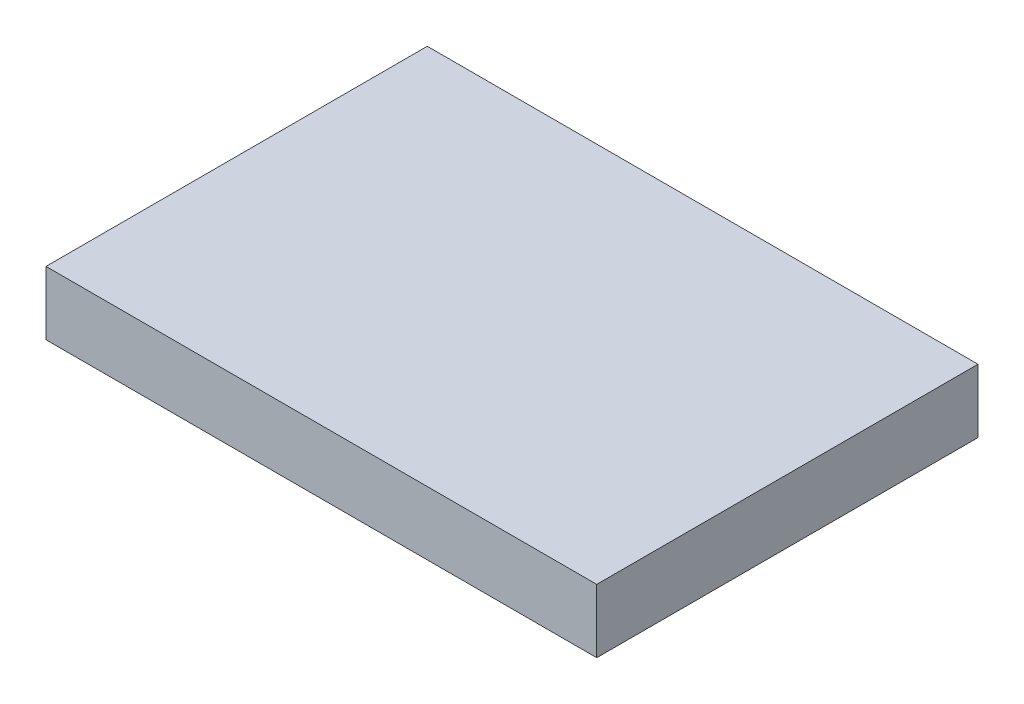
ISO-10303-21;
HEADER;
FILE_DESCRIPTION(('STEP AP214'),'2;1');
FILE_NAME('part.step','',(''),(''),'','','');
FILE_SCHEMA(('AUTOMOTIVE_DESIGN { 1 0 10303 214 1 1 1 1 }'));
ENDSEC;
DATA;
#1=APPLICATION_CONTEXT('core data for automotive mechanical design processes');
#2=APPLICATION_PROTOCOL_DEFINITION('international standard','automotive_design',2000,#1);
#3=PRODUCT_CONTEXT('',#1,'mechanical');
#4=PRODUCT('Part','Part','',(#3));
#5=PRODUCT_RELATED_PRODUCT_CATEGORY('part','',(#4));
#6=PRODUCT_DEFINITION_FORMATION('','',#4);
#7=PRODUCT_DEFINITION_CONTEXT('part definition',#1,'design');
#8=PRODUCT_DEFINITION('design','',#6,#7);
#9=PRODUCT_DEFINITION_SHAPE('','',#8);
#10=(LENGTH_UNIT() NAMED_UNIT(*) SI_UNIT(.MILLI.,.METRE.));
#11=(NAMED_UNIT(*) PLANE_ANGLE_UNIT() SI_UNIT($,.RADIAN.));
#12=(NAMED_UNIT(*) SI_UNIT($,.STERADIAN.) SOLID_ANGLE_UNIT());
#13=UNCERTAINTY_MEASURE_WITH_UNIT(LENGTH_MEASURE(1.E-05),#10,'distance_accuracy_value','');
#14=(GEOMETRIC_REPRESENTATION_CONTEXT(3) GLOBAL_UNCERTAINTY_ASSIGNED_CONTEXT((#13)) GLOBAL_UNIT_ASSIGNED_CONTEXT((#10,
#11,#12)) REPRESENTATION_CONTEXT('',''));
#15=CARTESIAN_POINT('',(0.,0.,0.));
#16=DIRECTION('',(0.,0.,1.));
#17=DIRECTION('',(1.,0.,0.));
#18=AXIS2_PLACEMENT_3D('',#15,#16,#17);
#19=CARTESIAN_POINT('',(130.,-15.,180.));
#20=DIRECTION('',(-1.,0.,0.));
#21=DIRECTION('',(0.,0.,1.));
#22=AXIS2_PLACEMENT_3D('',#19,#20,#21);
#23=PLANE('',#22);
#24=DIRECTION('',(0.,1.,0.));
#25=VECTOR('',#24,1.);
#26=CARTESIAN_POINT('',(130.,-15.,0.));
#27=LINE('',#26,#25);
#28=CARTESIAN_POINT('',(130.,-15.,0.));
#29=VERTEX_POINT('',#28);
#30=CARTESIAN_POINT('',(130.,15.,0.));
#31=VERTEX_POINT('',#30);
#32=EDGE_CURVE('E113',#29,#31,#27,.T.);
#33=ORIENTED_EDGE('',*,*,#32,.T.);
#34=DIRECTION('',(0.,0.,-1.));
#35=VECTOR('',#34,1.);
#36=CARTESIAN_POINT('',(130.,15.,180.));
#37=LINE('',#36,#35);
#38=CARTESIAN_POINT('',(130.,15.,180.));
#39=VERTEX_POINT('',#38);
#40=EDGE_CURVE('E11',#39,#31,#37,.T.);
#41=ORIENTED_EDGE('',*,*,#40,.F.);
#42=DIRECTION('',(0.,1.,0.));
#43=VECTOR('',#42,1.);
#44=CARTESIAN_POINT('',(130.,-15.,180.));
#45=LINE('',#44,#43);
#46=CARTESIAN_POINT('',(130.,-15.,180.));
#47=VERTEX_POINT('',#46);
#48=EDGE_CURVE('E97',#47,#39,#45,.T.);
#49=ORIENTED_EDGE('',*,*,#48,.F.);
#50=DIRECTION('',(0.,0.,-1.));
#51=VECTOR('',#50,1.);
#52=CARTESIAN_POINT('',(130.,-15.,180.));
#53=LINE('',#52,#51);
#54=EDGE_CURVE('E109',#47,#29,#53,.T.);
#55=ORIENTED_EDGE('',*,*,#54,.T.);
#56=EDGE_LOOP('',(#33,#41,#49,#55));
#57=FACE_BOUND('',#56,.T.);
#58=ADVANCED_FACE('F45',(#57),#23,.F.);
#59=CARTESIAN_POINT('',(-130.,15.,180.));
#60=DIRECTION('',(0.,-1.,0.));
#61=DIRECTION('',(0.,0.,-1.));
#62=AXIS2_PLACEMENT_3D('',#59,#60,#61);
#63=PLANE('',#62);
#64=DIRECTION('',(-1.,0.,0.));
#65=VECTOR('',#64,1.);
#66=CARTESIAN_POINT('',(-130.,15.,0.));
#67=LINE('',#66,#65);
#68=CARTESIAN_POINT('',(-130.,15.,0.));
#69=VERTEX_POINT('',#68);
#70=EDGE_CURVE('E102',#31,#69,#67,.T.);
#71=ORIENTED_EDGE('',*,*,#70,.T.);
#72=DIRECTION('',(0.,0.,-1.));
#73=VECTOR('',#72,1.);
#74=CARTESIAN_POINT('',(-130.,15.,180.));
#75=LINE('',#74,#73);
#76=CARTESIAN_POINT('',(-130.,15.,180.));
#77=VERTEX_POINT('',#76);
#78=EDGE_CURVE('E54',#77,#69,#75,.T.);
#79=ORIENTED_EDGE('',*,*,#78,.F.);
#80=DIRECTION('',(-1.,0.,0.));
#81=VECTOR('',#80,1.);
#82=CARTESIAN_POINT('',(-130.,15.,180.));
#83=LINE('',#82,#81);
#84=EDGE_CURVE('E92',#39,#77,#83,.T.);
#85=ORIENTED_EDGE('',*,*,#84,.F.);
#86=ORIENTED_EDGE('',*,*,#40,.T.);
#87=EDGE_LOOP('',(#71,#79,#85,#86));
#88=FACE_BOUND('',#87,.T.);
#89=ADVANCED_FACE('F101',(#88),#63,.F.);
#90=CARTESIAN_POINT('',(-130.,-15.,180.));
#91=DIRECTION('',(1.,0.,0.));
#92=DIRECTION('',(0.,0.,-1.));
#93=AXIS2_PLACEMENT_3D('',#90,#91,#92);
#94=PLANE('',#93);
#95=DIRECTION('',(0.,-1.,0.));
#96=VECTOR('',#95,1.);
#97=CARTESIAN_POINT('',(-130.,-15.,0.));
#98=LINE('',#97,#96);
#99=CARTESIAN_POINT('',(-130.,-15.,0.));
#100=VERTEX_POINT('',#99);
#101=EDGE_CURVE('E79',#69,#100,#98,.T.);
#102=ORIENTED_EDGE('',*,*,#101,.T.);
#103=DIRECTION('',(0.,0.,-1.));
#104=VECTOR('',#103,1.);
#105=CARTESIAN_POINT('',(-130.,-15.,180.));
#106=LINE('',#105,#104);
#107=CARTESIAN_POINT('',(-130.,-15.,180.));
#108=VERTEX_POINT('',#107);
#109=EDGE_CURVE('E104',#108,#100,#106,.T.);
#110=ORIENTED_EDGE('',*,*,#109,.F.);
#111=DIRECTION('',(0.,-1.,0.));
#112=VECTOR('',#111,1.);
#113=CARTESIAN_POINT('',(-130.,-15.,180.));
#114=LINE('',#113,#112);
#115=EDGE_CURVE('E95',#77,#108,#114,.T.);
#116=ORIENTED_EDGE('',*,*,#115,.F.);
#117=ORIENTED_EDGE('',*,*,#78,.T.);
#118=EDGE_LOOP('',(#102,#110,#116,#117));
#119=FACE_BOUND('',#118,.T.);
#120=ADVANCED_FACE('F105',(#119),#94,.F.);
#121=CARTESIAN_POINT('',(-130.,-15.,180.));
#122=DIRECTION('',(0.,1.,0.));
#123=DIRECTION('',(0.,0.,1.));
#124=AXIS2_PLACEMENT_3D('',#121,#122,#123);
#125=PLANE('',#124);
#126=DIRECTION('',(1.,0.,0.));
#127=VECTOR('',#126,1.);
#128=CARTESIAN_POINT('',(-130.,-15.,0.));
#129=LINE('',#128,#127);
#130=EDGE_CURVE('E85',#100,#29,#129,.T.);
#131=ORIENTED_EDGE('',*,*,#130,.T.);
#132=ORIENTED_EDGE('',*,*,#54,.F.);
#133=DIRECTION('',(1.,0.,0.));
#134=VECTOR('',#133,1.);
#135=CARTESIAN_POINT('',(-130.,-15.,180.));
#136=LINE('',#135,#134);
#137=EDGE_CURVE('E62',#108,#47,#136,.T.);
#138=ORIENTED_EDGE('',*,*,#137,.F.);
#139=ORIENTED_EDGE('',*,*,#109,.T.);
#140=EDGE_LOOP('',(#131,#132,#138,#139));
#141=FACE_BOUND('',#140,.T.);
#142=ADVANCED_FACE('F126',(#141),#125,.F.);
#143=CARTESIAN_POINT('',(0.,0.,180.));
#144=DIRECTION('',(0.,0.,-1.));
#145=DIRECTION('',(-1.,0.,0.));
#146=AXIS2_PLACEMENT_3D('',#143,#144,#145);
#147=PLANE('',#146);
#148=ORIENTED_EDGE('',*,*,#48,.T.);
#149=ORIENTED_EDGE('',*,*,#84,.T.);
#150=ORIENTED_EDGE('',*,*,#115,.T.);
#151=ORIENTED_EDGE('',*,*,#137,.T.);
#152=EDGE_LOOP('',(#148,#149,#150,#151));
#153=FACE_BOUND('',#152,.T.);
#154=ADVANCED_FACE('F93',(#153),#147,.F.);
#155=CARTESIAN_POINT('',(0.,0.,0.));
#156=DIRECTION('',(0.,0.,-1.));
#157=DIRECTION('',(-1.,0.,0.));
#158=AXIS2_PLACEMENT_3D('',#155,#156,#157);
#159=PLANE('',#158);
#160=ORIENTED_EDGE('',*,*,#32,.F.);
#161=ORIENTED_EDGE('',*,*,#130,.F.);
#162=ORIENTED_EDGE('',*,*,#101,.F.);
#163=ORIENTED_EDGE('',*,*,#70,.F.);
#164=EDGE_LOOP('',(#160,#161,#162,#163));
#165=FACE_BOUND('',#164,.T.);
#166=ADVANCED_FACE('F129',(#165),#159,.T.);
#167=CLOSED_SHELL('',(#58,#89,#120,#142,#154,#166));
#168=MANIFOLD_SOLID_BREP('B2',#167);
#169=ADVANCED_BREP_SHAPE_REPRESENTATION('',(#18,#168),#14);
#170=SHAPE_DEFINITION_REPRESENTATION(#9,#169);
ENDSEC;
END-ISO-10303-21;
